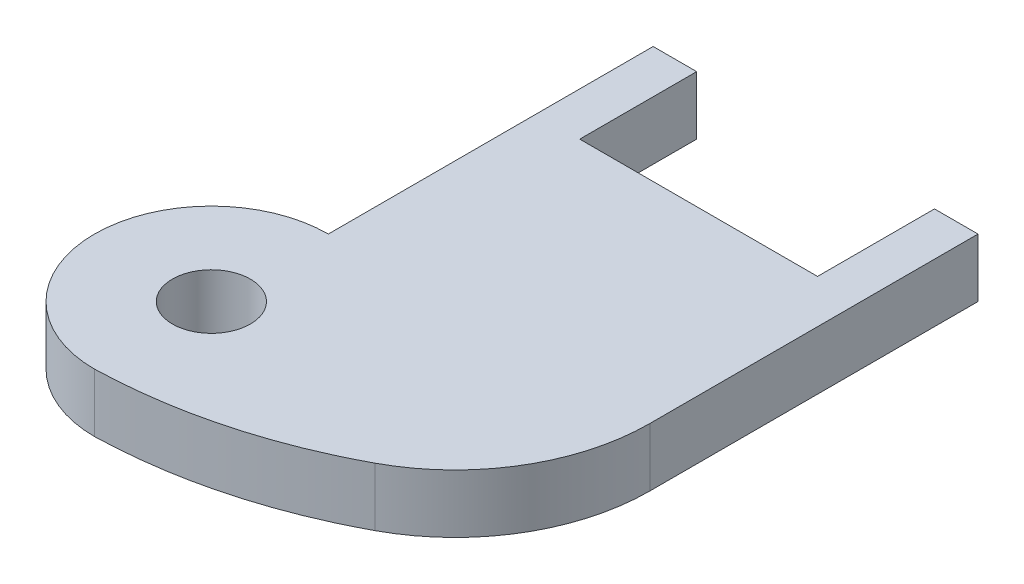
ISO-10303-21;
HEADER;
FILE_DESCRIPTION(('STEP AP214'),'2;1');
FILE_NAME('part.step','',(''),(''),'','','');
FILE_SCHEMA(('AUTOMOTIVE_DESIGN { 1 0 10303 214 1 1 1 1 }'));
ENDSEC;
DATA;
#1=APPLICATION_CONTEXT('core data for automotive mechanical design processes');
#2=APPLICATION_PROTOCOL_DEFINITION('international standard','automotive_design',2000,#1);
#3=PRODUCT_CONTEXT('',#1,'mechanical');
#4=PRODUCT('Part','Part','',(#3));
#5=PRODUCT_RELATED_PRODUCT_CATEGORY('part','',(#4));
#6=PRODUCT_DEFINITION_FORMATION('','',#4);
#7=PRODUCT_DEFINITION_CONTEXT('part definition',#1,'design');
#8=PRODUCT_DEFINITION('design','',#6,#7);
#9=PRODUCT_DEFINITION_SHAPE('','',#8);
#10=(LENGTH_UNIT() NAMED_UNIT(*) SI_UNIT(.MILLI.,.METRE.));
#11=(NAMED_UNIT(*) PLANE_ANGLE_UNIT() SI_UNIT($,.RADIAN.));
#12=(NAMED_UNIT(*) SI_UNIT($,.STERADIAN.) SOLID_ANGLE_UNIT());
#13=UNCERTAINTY_MEASURE_WITH_UNIT(LENGTH_MEASURE(1.E-05),#10,'distance_accuracy_value','');
#14=(GEOMETRIC_REPRESENTATION_CONTEXT(3) GLOBAL_UNCERTAINTY_ASSIGNED_CONTEXT((#13)) GLOBAL_UNIT_ASSIGNED_CONTEXT((#10,
#11,#12)) REPRESENTATION_CONTEXT('',''));
#15=CARTESIAN_POINT('',(0.,0.,0.));
#16=DIRECTION('',(0.,0.,1.));
#17=DIRECTION('',(1.,0.,0.));
#18=AXIS2_PLACEMENT_3D('',#15,#16,#17);
#19=CARTESIAN_POINT('',(0.,3.,22.6666666666667));
#20=DIRECTION('',(0.,-1.,0.));
#21=DIRECTION('',(0.,0.,-1.));
#22=AXIS2_PLACEMENT_3D('',#19,#20,#21);
#23=CYLINDRICAL_SURFACE('',#22,6.);
#24=CARTESIAN_POINT('',(0.,0.,22.6666666666667));
#25=DIRECTION('',(0.,1.,0.));
#26=DIRECTION('',(0.,0.,1.));
#27=AXIS2_PLACEMENT_3D('',#24,#25,#26);
#28=CIRCLE('',#27,6.);
#29=CARTESIAN_POINT('',(0.,0.,16.6666666666667));
#30=VERTEX_POINT('',#29);
#31=CARTESIAN_POINT('',(0.,0.,28.6666666666667));
#32=VERTEX_POINT('',#31);
#33=EDGE_CURVE('E144',#30,#32,#28,.T.);
#34=ORIENTED_EDGE('',*,*,#33,.T.);
#35=DIRECTION('',(0.,-1.,0.));
#36=VECTOR('',#35,1.);
#37=CARTESIAN_POINT('',(0.,3.,28.6666666666667));
#38=LINE('',#37,#36);
#39=CARTESIAN_POINT('',(0.,3.,28.6666666666667));
#40=VERTEX_POINT('',#39);
#41=EDGE_CURVE('E124',#40,#32,#38,.T.);
#42=ORIENTED_EDGE('',*,*,#41,.F.);
#43=CARTESIAN_POINT('',(0.,3.,22.6666666666667));
#44=DIRECTION('',(0.,1.,0.));
#45=DIRECTION('',(0.,0.,1.));
#46=AXIS2_PLACEMENT_3D('',#43,#44,#45);
#47=CIRCLE('',#46,6.);
#48=CARTESIAN_POINT('',(0.,3.,16.6666666666667));
#49=VERTEX_POINT('',#48);
#50=EDGE_CURVE('E133',#49,#40,#47,.T.);
#51=ORIENTED_EDGE('',*,*,#50,.F.);
#52=DIRECTION('',(0.,-1.,0.));
#53=VECTOR('',#52,1.);
#54=CARTESIAN_POINT('',(0.,3.,16.6666666666667));
#55=LINE('',#54,#53);
#56=EDGE_CURVE('E164',#49,#30,#55,.T.);
#57=ORIENTED_EDGE('',*,*,#56,.T.);
#58=EDGE_LOOP('',(#34,#42,#51,#57));
#59=FACE_BOUND('',#58,.T.);
#60=ADVANCED_FACE('F50',(#59),#23,.T.);
#61=CARTESIAN_POINT('',(0.,3.,28.6666666666667));
#62=CARTESIAN_POINT('',(9.2126277136619,3.,28.3929381732667));
#63=CARTESIAN_POINT('',(16.6666666666667,3.,22.));
#64=B_SPLINE_CURVE_WITH_KNOTS('',2,(#61,#62,#63),.UNSPECIFIED.,.F.,.F.,(3,3),(0.,1.),.UNSPECIFIED.);
#65=DIRECTION('',(0.,-1.,0.));
#66=VECTOR('',#65,1.);
#67=SURFACE_OF_LINEAR_EXTRUSION('',#64,#66);
#68=CARTESIAN_POINT('',(0.,0.,28.6666666666667));
#69=CARTESIAN_POINT('',(9.2126277136619,0.,28.3929381732667));
#70=CARTESIAN_POINT('',(16.6666666666667,0.,22.));
#71=B_SPLINE_CURVE_WITH_KNOTS('',2,(#68,#69,#70),.UNSPECIFIED.,.F.,.F.,(3,3),(0.,1.),.UNSPECIFIED.);
#72=CARTESIAN_POINT('',(11.3839103321823,0.,25.6455539136062));
#73=VERTEX_POINT('',#72);
#74=EDGE_CURVE('E175',#32,#73,#71,.T.);
#75=ORIENTED_EDGE('',*,*,#74,.T.);
#76=DIRECTION('',(0.,-1.,0.));
#77=VECTOR('',#76,1.);
#78=CARTESIAN_POINT('',(11.3839103321823,0.,25.6455539136062));
#79=LINE('',#78,#77);
#80=CARTESIAN_POINT('',(11.3839103321823,3.,25.6455539136062));
#81=VERTEX_POINT('',#80);
#82=EDGE_CURVE('E57',#73,#81,#79,.F.);
#83=ORIENTED_EDGE('',*,*,#82,.T.);
#84=EDGE_CURVE('E121',#40,#81,#64,.T.);
#85=ORIENTED_EDGE('',*,*,#84,.F.);
#86=ORIENTED_EDGE('',*,*,#41,.T.);
#87=EDGE_LOOP('',(#75,#83,#85,#86));
#88=FACE_BOUND('',#87,.T.);
#89=ADVANCED_FACE('F122',(#88),#67,.F.);
#90=CARTESIAN_POINT('',(16.6666666666667,3.,0.));
#91=DIRECTION('',(1.,0.,0.));
#92=DIRECTION('',(0.,0.,-1.));
#93=AXIS2_PLACEMENT_3D('',#90,#91,#92);
#94=PLANE('',#93);
#95=DIRECTION('',(0.,0.,1.));
#96=VECTOR('',#95,1.);
#97=CARTESIAN_POINT('',(16.6666666666667,3.,0.));
#98=LINE('',#97,#96);
#99=CARTESIAN_POINT('',(16.6666666666667,3.,0.));
#100=VERTEX_POINT('',#99);
#101=CARTESIAN_POINT('',(16.6666666666667,3.,16.8280932700789));
#102=VERTEX_POINT('',#101);
#103=EDGE_CURVE('E128',#100,#102,#98,.T.);
#104=ORIENTED_EDGE('',*,*,#103,.T.);
#105=DIRECTION('',(0.,1.,0.));
#106=VECTOR('',#105,1.);
#107=CARTESIAN_POINT('',(16.6666666666667,0.,16.8280932700789));
#108=LINE('',#107,#106);
#109=CARTESIAN_POINT('',(16.6666666666667,0.,16.8280932700789));
#110=VERTEX_POINT('',#109);
#111=EDGE_CURVE('E150',#102,#110,#108,.F.);
#112=ORIENTED_EDGE('',*,*,#111,.T.);
#113=DIRECTION('',(0.,0.,1.));
#114=VECTOR('',#113,1.);
#115=CARTESIAN_POINT('',(16.6666666666667,0.,0.));
#116=LINE('',#115,#114);
#117=CARTESIAN_POINT('',(16.6666666666667,0.,0.));
#118=VERTEX_POINT('',#117);
#119=EDGE_CURVE('E172',#118,#110,#116,.T.);
#120=ORIENTED_EDGE('',*,*,#119,.F.);
#121=DIRECTION('',(0.,-1.,0.));
#122=VECTOR('',#121,1.);
#123=CARTESIAN_POINT('',(16.6666666666667,3.,0.));
#124=LINE('',#123,#122);
#125=EDGE_CURVE('E146',#100,#118,#124,.T.);
#126=ORIENTED_EDGE('',*,*,#125,.F.);
#127=EDGE_LOOP('',(#104,#112,#120,#126));
#128=FACE_BOUND('',#127,.T.);
#129=ADVANCED_FACE('F244',(#128),#94,.T.);
#130=CARTESIAN_POINT('',(0.,3.,0.));
#131=DIRECTION('',(0.,0.,-1.));
#132=DIRECTION('',(-1.,0.,0.));
#133=AXIS2_PLACEMENT_3D('',#130,#131,#132);
#134=PLANE('',#133);
#135=DIRECTION('',(1.,0.,0.));
#136=VECTOR('',#135,1.);
#137=CARTESIAN_POINT('',(0.,0.,0.));
#138=LINE('',#137,#136);
#139=CARTESIAN_POINT('',(14.4333333333333,0.,0.));
#140=VERTEX_POINT('',#139);
#141=EDGE_CURVE('E173',#140,#118,#138,.T.);
#142=ORIENTED_EDGE('',*,*,#141,.F.);
#143=DIRECTION('',(0.,-1.,0.));
#144=VECTOR('',#143,1.);
#145=CARTESIAN_POINT('',(14.4333333333333,3.,0.));
#146=LINE('',#145,#144);
#147=CARTESIAN_POINT('',(14.4333333333333,3.,0.));
#148=VERTEX_POINT('',#147);
#149=EDGE_CURVE('E154',#148,#140,#146,.T.);
#150=ORIENTED_EDGE('',*,*,#149,.F.);
#151=DIRECTION('',(1.,0.,0.));
#152=VECTOR('',#151,1.);
#153=CARTESIAN_POINT('',(0.,3.,0.));
#154=LINE('',#153,#152);
#155=EDGE_CURVE('E192',#148,#100,#154,.T.);
#156=ORIENTED_EDGE('',*,*,#155,.T.);
#157=ORIENTED_EDGE('',*,*,#125,.T.);
#158=EDGE_LOOP('',(#142,#150,#156,#157));
#159=FACE_BOUND('',#158,.T.);
#160=ADVANCED_FACE('F236',(#159),#134,.T.);
#161=CARTESIAN_POINT('',(14.4333333333333,3.,0.));
#162=DIRECTION('',(1.,0.,0.));
#163=DIRECTION('',(0.,0.,-1.));
#164=AXIS2_PLACEMENT_3D('',#161,#162,#163);
#165=PLANE('',#164);
#166=DIRECTION('',(0.,0.,1.));
#167=VECTOR('',#166,1.);
#168=CARTESIAN_POINT('',(14.4333333333333,0.,0.));
#169=LINE('',#168,#167);
#170=CARTESIAN_POINT('',(14.4333333333333,0.,6.));
#171=VERTEX_POINT('',#170);
#172=EDGE_CURVE('E169',#140,#171,#169,.T.);
#173=ORIENTED_EDGE('',*,*,#172,.T.);
#174=DIRECTION('',(0.,-1.,0.));
#175=VECTOR('',#174,1.);
#176=CARTESIAN_POINT('',(14.4333333333333,3.,6.));
#177=LINE('',#176,#175);
#178=CARTESIAN_POINT('',(14.4333333333333,3.,6.));
#179=VERTEX_POINT('',#178);
#180=EDGE_CURVE('E224',#179,#171,#177,.T.);
#181=ORIENTED_EDGE('',*,*,#180,.F.);
#182=DIRECTION('',(0.,0.,1.));
#183=VECTOR('',#182,1.);
#184=CARTESIAN_POINT('',(14.4333333333333,3.,0.));
#185=LINE('',#184,#183);
#186=EDGE_CURVE('E194',#148,#179,#185,.T.);
#187=ORIENTED_EDGE('',*,*,#186,.F.);
#188=ORIENTED_EDGE('',*,*,#149,.T.);
#189=EDGE_LOOP('',(#173,#181,#187,#188));
#190=FACE_BOUND('',#189,.T.);
#191=ADVANCED_FACE('F232',(#190),#165,.F.);
#192=CARTESIAN_POINT('',(0.,3.,6.));
#193=DIRECTION('',(0.,0.,1.));
#194=DIRECTION('',(1.,0.,0.));
#195=AXIS2_PLACEMENT_3D('',#192,#193,#194);
#196=PLANE('',#195);
#197=DIRECTION('',(-1.,0.,0.));
#198=VECTOR('',#197,1.);
#199=CARTESIAN_POINT('',(0.,0.,6.));
#200=LINE('',#199,#198);
#201=CARTESIAN_POINT('',(2.23333333333333,0.,6.));
#202=VERTEX_POINT('',#201);
#203=EDGE_CURVE('E168',#171,#202,#200,.T.);
#204=ORIENTED_EDGE('',*,*,#203,.T.);
#205=DIRECTION('',(0.,-1.,0.));
#206=VECTOR('',#205,1.);
#207=CARTESIAN_POINT('',(2.23333333333333,3.,6.));
#208=LINE('',#207,#206);
#209=CARTESIAN_POINT('',(2.23333333333333,3.,6.));
#210=VERTEX_POINT('',#209);
#211=EDGE_CURVE('E216',#210,#202,#208,.T.);
#212=ORIENTED_EDGE('',*,*,#211,.F.);
#213=DIRECTION('',(-1.,0.,0.));
#214=VECTOR('',#213,1.);
#215=CARTESIAN_POINT('',(0.,3.,6.));
#216=LINE('',#215,#214);
#217=EDGE_CURVE('E181',#179,#210,#216,.T.);
#218=ORIENTED_EDGE('',*,*,#217,.F.);
#219=ORIENTED_EDGE('',*,*,#180,.T.);
#220=EDGE_LOOP('',(#204,#212,#218,#219));
#221=FACE_BOUND('',#220,.T.);
#222=ADVANCED_FACE('F246',(#221),#196,.F.);
#223=CARTESIAN_POINT('',(2.23333333333333,3.,0.));
#224=DIRECTION('',(1.,0.,0.));
#225=DIRECTION('',(0.,0.,-1.));
#226=AXIS2_PLACEMENT_3D('',#223,#224,#225);
#227=PLANE('',#226);
#228=DIRECTION('',(0.,0.,1.));
#229=VECTOR('',#228,1.);
#230=CARTESIAN_POINT('',(2.23333333333333,0.,0.));
#231=LINE('',#230,#229);
#232=CARTESIAN_POINT('',(2.23333333333333,0.,0.));
#233=VERTEX_POINT('',#232);
#234=EDGE_CURVE('E218',#233,#202,#231,.T.);
#235=ORIENTED_EDGE('',*,*,#234,.F.);
#236=DIRECTION('',(0.,-1.,0.));
#237=VECTOR('',#236,1.);
#238=CARTESIAN_POINT('',(2.23333333333333,3.,0.));
#239=LINE('',#238,#237);
#240=CARTESIAN_POINT('',(2.23333333333333,3.,0.));
#241=VERTEX_POINT('',#240);
#242=EDGE_CURVE('E191',#241,#233,#239,.T.);
#243=ORIENTED_EDGE('',*,*,#242,.F.);
#244=DIRECTION('',(0.,0.,1.));
#245=VECTOR('',#244,1.);
#246=CARTESIAN_POINT('',(2.23333333333333,3.,0.));
#247=LINE('',#246,#245);
#248=EDGE_CURVE('E182',#241,#210,#247,.T.);
#249=ORIENTED_EDGE('',*,*,#248,.T.);
#250=ORIENTED_EDGE('',*,*,#211,.T.);
#251=EDGE_LOOP('',(#235,#243,#249,#250));
#252=FACE_BOUND('',#251,.T.);
#253=ADVANCED_FACE('F214',(#252),#227,.T.);
#254=CARTESIAN_POINT('',(0.,0.,0.));
#255=VERTEX_POINT('',#254);
#256=EDGE_CURVE('E178',#255,#233,#138,.T.);
#257=ORIENTED_EDGE('',*,*,#256,.F.);
#258=DIRECTION('',(0.,-1.,0.));
#259=VECTOR('',#258,1.);
#260=CARTESIAN_POINT('',(0.,3.,0.));
#261=LINE('',#260,#259);
#262=CARTESIAN_POINT('',(0.,3.,0.));
#263=VERTEX_POINT('',#262);
#264=EDGE_CURVE('E190',#263,#255,#261,.T.);
#265=ORIENTED_EDGE('',*,*,#264,.F.);
#266=EDGE_CURVE('E167',#263,#241,#154,.T.);
#267=ORIENTED_EDGE('',*,*,#266,.T.);
#268=ORIENTED_EDGE('',*,*,#242,.T.);
#269=EDGE_LOOP('',(#257,#265,#267,#268));
#270=FACE_BOUND('',#269,.T.);
#271=ADVANCED_FACE('F207',(#270),#134,.T.);
#272=CARTESIAN_POINT('',(0.,3.,22.6666666666667));
#273=DIRECTION('',(0.,-1.,0.));
#274=DIRECTION('',(0.,0.,-1.));
#275=AXIS2_PLACEMENT_3D('',#272,#273,#274);
#276=CYLINDRICAL_SURFACE('',#275,2.);
#277=CARTESIAN_POINT('',(0.,3.,22.6666666666667));
#278=DIRECTION('',(0.,1.,0.));
#279=DIRECTION('',(0.,0.,1.));
#280=AXIS2_PLACEMENT_3D('',#277,#278,#279);
#281=CIRCLE('',#280,2.);
#282=CARTESIAN_POINT('',(0.,3.,24.6666666666667));
#283=VERTEX_POINT('',#282);
#284=EDGE_CURVE('E142',#283,#283,#281,.T.);
#285=ORIENTED_EDGE('',*,*,#284,.T.);
#286=EDGE_LOOP('',(#285));
#287=FACE_BOUND('',#286,.T.);
#288=CARTESIAN_POINT('',(0.,0.,22.6666666666667));
#289=DIRECTION('',(0.,1.,0.));
#290=DIRECTION('',(0.,0.,1.));
#291=AXIS2_PLACEMENT_3D('',#288,#289,#290);
#292=CIRCLE('',#291,2.);
#293=CARTESIAN_POINT('',(0.,0.,24.6666666666667));
#294=VERTEX_POINT('',#293);
#295=EDGE_CURVE('E253',#294,#294,#292,.T.);
#296=ORIENTED_EDGE('',*,*,#295,.F.);
#297=EDGE_LOOP('',(#296));
#298=FACE_BOUND('',#297,.T.);
#299=ADVANCED_FACE('F269',(#287,#298),#276,.F.);
#300=CARTESIAN_POINT('',(0.,3.,0.));
#301=DIRECTION('',(1.,0.,0.));
#302=DIRECTION('',(0.,0.,-1.));
#303=AXIS2_PLACEMENT_3D('',#300,#301,#302);
#304=PLANE('',#303);
#305=DIRECTION('',(0.,0.,1.));
#306=VECTOR('',#305,1.);
#307=CARTESIAN_POINT('',(0.,0.,0.));
#308=LINE('',#307,#306);
#309=EDGE_CURVE('E180',#255,#30,#308,.T.);
#310=ORIENTED_EDGE('',*,*,#309,.T.);
#311=ORIENTED_EDGE('',*,*,#56,.F.);
#312=DIRECTION('',(0.,0.,1.));
#313=VECTOR('',#312,1.);
#314=CARTESIAN_POINT('',(0.,3.,0.));
#315=LINE('',#314,#313);
#316=EDGE_CURVE('E140',#263,#49,#315,.T.);
#317=ORIENTED_EDGE('',*,*,#316,.F.);
#318=ORIENTED_EDGE('',*,*,#264,.T.);
#319=EDGE_LOOP('',(#310,#311,#317,#318));
#320=FACE_BOUND('',#319,.T.);
#321=ADVANCED_FACE('F268',(#320),#304,.F.);
#322=CARTESIAN_POINT('',(0.,3.,0.));
#323=DIRECTION('',(0.,1.,0.));
#324=DIRECTION('',(0.,0.,1.));
#325=AXIS2_PLACEMENT_3D('',#322,#323,#324);
#326=PLANE('',#325);
#327=ORIENTED_EDGE('',*,*,#284,.F.);
#328=EDGE_LOOP('',(#327));
#329=FACE_BOUND('',#328,.T.);
#330=ORIENTED_EDGE('',*,*,#84,.T.);
#331=CARTESIAN_POINT('',(6.66666666666666,3.,16.8280932700789));
#332=DIRECTION('',(0.,1.,0.));
#333=DIRECTION('',(0.,0.,1.));
#334=AXIS2_PLACEMENT_3D('',#331,#332,#333);
#335=CIRCLE('',#334,10.);
#336=EDGE_CURVE('E11',#81,#102,#335,.T.);
#337=ORIENTED_EDGE('',*,*,#336,.T.);
#338=ORIENTED_EDGE('',*,*,#103,.F.);
#339=ORIENTED_EDGE('',*,*,#155,.F.);
#340=ORIENTED_EDGE('',*,*,#186,.T.);
#341=ORIENTED_EDGE('',*,*,#217,.T.);
#342=ORIENTED_EDGE('',*,*,#248,.F.);
#343=ORIENTED_EDGE('',*,*,#266,.F.);
#344=ORIENTED_EDGE('',*,*,#316,.T.);
#345=ORIENTED_EDGE('',*,*,#50,.T.);
#346=EDGE_LOOP('',(#330,#337,#338,#339,#340,#341,#342,#343,#344,#345));
#347=FACE_BOUND('',#346,.T.);
#348=ADVANCED_FACE('F135',(#329,#347),#326,.T.);
#349=CARTESIAN_POINT('',(0.,0.,0.));
#350=DIRECTION('',(0.,1.,0.));
#351=DIRECTION('',(0.,0.,1.));
#352=AXIS2_PLACEMENT_3D('',#349,#350,#351);
#353=PLANE('',#352);
#354=ORIENTED_EDGE('',*,*,#295,.T.);
#355=EDGE_LOOP('',(#354));
#356=FACE_BOUND('',#355,.T.);
#357=ORIENTED_EDGE('',*,*,#119,.T.);
#358=CARTESIAN_POINT('',(6.66666666666666,0.,16.8280932700789));
#359=DIRECTION('',(0.,1.,0.));
#360=DIRECTION('',(0.,0.,1.));
#361=AXIS2_PLACEMENT_3D('',#358,#359,#360);
#362=CIRCLE('',#361,10.);
#363=EDGE_CURVE('E69',#110,#73,#362,.F.);
#364=ORIENTED_EDGE('',*,*,#363,.T.);
#365=ORIENTED_EDGE('',*,*,#74,.F.);
#366=ORIENTED_EDGE('',*,*,#33,.F.);
#367=ORIENTED_EDGE('',*,*,#309,.F.);
#368=ORIENTED_EDGE('',*,*,#256,.T.);
#369=ORIENTED_EDGE('',*,*,#234,.T.);
#370=ORIENTED_EDGE('',*,*,#203,.F.);
#371=ORIENTED_EDGE('',*,*,#172,.F.);
#372=ORIENTED_EDGE('',*,*,#141,.T.);
#373=EDGE_LOOP('',(#357,#364,#365,#366,#367,#368,#369,#370,#371,#372));
#374=FACE_BOUND('',#373,.T.);
#375=ADVANCED_FACE('F240',(#356,#374),#353,.F.);
#376=CARTESIAN_POINT('',(6.66666666666666,1.5,16.8280932700789));
#377=DIRECTION('',(0.,-1.,0.));
#378=DIRECTION('',(0.,0.,-1.));
#379=AXIS2_PLACEMENT_3D('',#376,#377,#378);
#380=CYLINDRICAL_SURFACE('',#379,10.);
#381=ORIENTED_EDGE('',*,*,#336,.F.);
#382=ORIENTED_EDGE('',*,*,#82,.F.);
#383=ORIENTED_EDGE('',*,*,#363,.F.);
#384=ORIENTED_EDGE('',*,*,#111,.F.);
#385=EDGE_LOOP('',(#381,#382,#383,#384));
#386=FACE_BOUND('',#385,.T.);
#387=ADVANCED_FACE('F47',(#386),#380,.T.);
#388=CLOSED_SHELL('',(#60,#89,#129,#160,#191,#222,#253,#271,#299,#321,#348,#375,#387));
#389=MANIFOLD_SOLID_BREP('B2',#388);
#390=ADVANCED_BREP_SHAPE_REPRESENTATION('',(#18,#389),#14);
#391=SHAPE_DEFINITION_REPRESENTATION(#9,#390);
ENDSEC;
END-ISO-10303-21;
